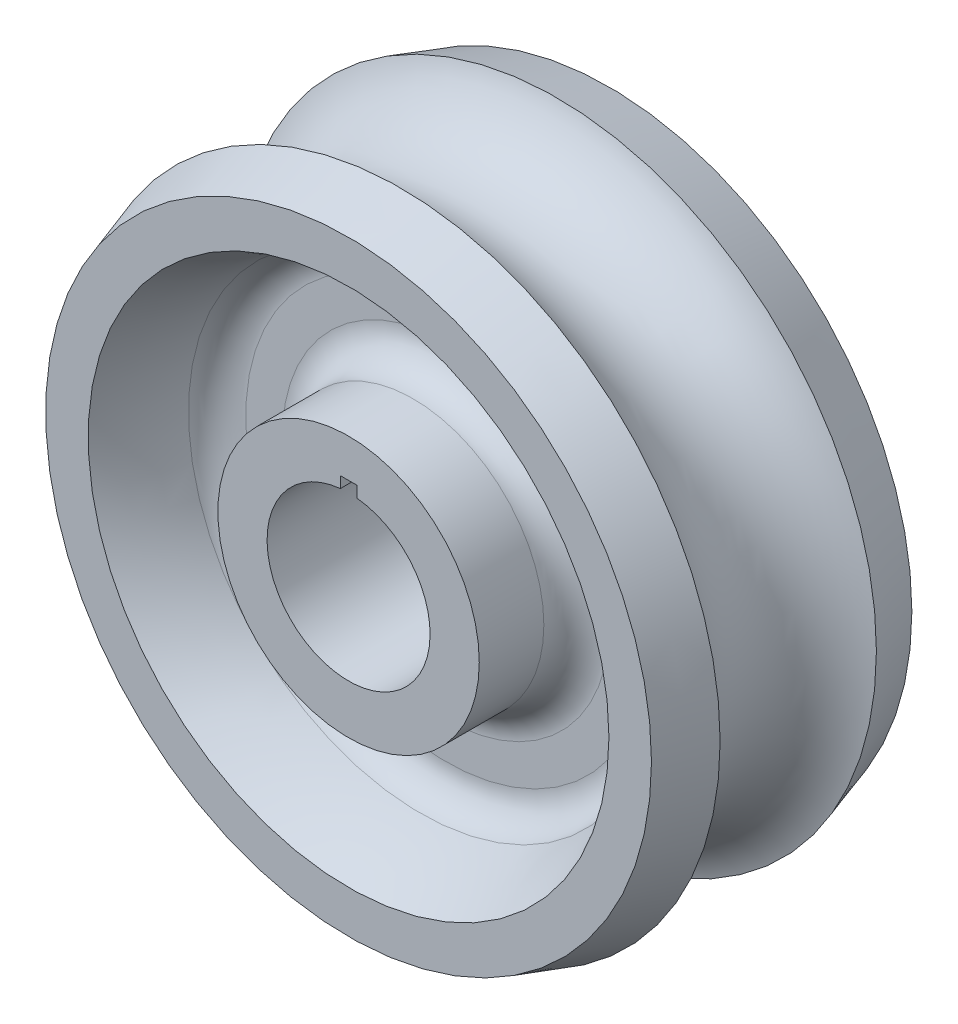
ISO-10303-21;
HEADER;
FILE_DESCRIPTION(('STEP AP214'),'2;1');
FILE_NAME('part.step','',(''),(''),'','','');
FILE_SCHEMA(('AUTOMOTIVE_DESIGN { 1 0 10303 214 1 1 1 1 }'));
ENDSEC;
DATA;
#1=APPLICATION_CONTEXT('core data for automotive mechanical design processes');
#2=APPLICATION_PROTOCOL_DEFINITION('international standard','automotive_design',2000,#1);
#3=PRODUCT_CONTEXT('',#1,'mechanical');
#4=PRODUCT('Part','Part','',(#3));
#5=PRODUCT_RELATED_PRODUCT_CATEGORY('part','',(#4));
#6=PRODUCT_DEFINITION_FORMATION('','',#4);
#7=PRODUCT_DEFINITION_CONTEXT('part definition',#1,'design');
#8=PRODUCT_DEFINITION('design','',#6,#7);
#9=PRODUCT_DEFINITION_SHAPE('','',#8);
#10=(LENGTH_UNIT() NAMED_UNIT(*) SI_UNIT(.MILLI.,.METRE.));
#11=(NAMED_UNIT(*) PLANE_ANGLE_UNIT() SI_UNIT($,.RADIAN.));
#12=(NAMED_UNIT(*) SI_UNIT($,.STERADIAN.) SOLID_ANGLE_UNIT());
#13=UNCERTAINTY_MEASURE_WITH_UNIT(LENGTH_MEASURE(1.E-05),#10,'distance_accuracy_value','');
#14=(GEOMETRIC_REPRESENTATION_CONTEXT(3) GLOBAL_UNCERTAINTY_ASSIGNED_CONTEXT((#13)) GLOBAL_UNIT_ASSIGNED_CONTEXT((#10,
#11,#12)) REPRESENTATION_CONTEXT('',''));
#15=CARTESIAN_POINT('',(0.,0.,0.));
#16=DIRECTION('',(0.,0.,1.));
#17=DIRECTION('',(1.,0.,0.));
#18=AXIS2_PLACEMENT_3D('',#15,#16,#17);
#19=CARTESIAN_POINT('',(0.,7.95,-12.7));
#20=DIRECTION('',(0.,0.,1.));
#21=DIRECTION('',(1.,0.,0.));
#22=AXIS2_PLACEMENT_3D('',#19,#20,#21);
#23=PLANE('',#22);
#24=CARTESIAN_POINT('',(0.,0.,-12.7));
#25=DIRECTION('',(0.,0.,1.));
#26=DIRECTION('',(1.,0.,0.));
#27=AXIS2_PLACEMENT_3D('',#24,#25,#26);
#28=CIRCLE('',#27,12.75);
#29=CARTESIAN_POINT('',(12.75,0.,-12.7));
#30=VERTEX_POINT('',#29);
#31=EDGE_CURVE('E106',#30,#30,#28,.T.);
#32=ORIENTED_EDGE('',*,*,#31,.F.);
#33=EDGE_LOOP('',(#32));
#34=FACE_BOUND('',#33,.T.);
#35=DIRECTION('',(0.,1.,0.));
#36=VECTOR('',#35,1.);
#37=CARTESIAN_POINT('',(-0.8,7.90964600977819,-12.7));
#38=LINE('',#37,#36);
#39=CARTESIAN_POINT('',(-0.8,7.90964600977819,-12.7));
#40=VERTEX_POINT('',#39);
#41=CARTESIAN_POINT('',(-0.8,9.,-12.7));
#42=VERTEX_POINT('',#41);
#43=EDGE_CURVE('E79',#40,#42,#38,.T.);
#44=ORIENTED_EDGE('',*,*,#43,.F.);
#45=CARTESIAN_POINT('',(0.,0.,-12.7));
#46=DIRECTION('',(0.,0.,1.));
#47=DIRECTION('',(1.,0.,0.));
#48=AXIS2_PLACEMENT_3D('',#45,#46,#47);
#49=CIRCLE('',#48,7.95);
#50=CARTESIAN_POINT('',(0.8,7.90964600977819,-12.7));
#51=VERTEX_POINT('',#50);
#52=EDGE_CURVE('E11',#40,#51,#49,.T.);
#53=ORIENTED_EDGE('',*,*,#52,.T.);
#54=DIRECTION('',(0.,1.,0.));
#55=VECTOR('',#54,1.);
#56=CARTESIAN_POINT('',(0.8,7.90964600977819,-12.7));
#57=LINE('',#56,#55);
#58=CARTESIAN_POINT('',(0.8,9.,-12.7));
#59=VERTEX_POINT('',#58);
#60=EDGE_CURVE('E55',#51,#59,#57,.T.);
#61=ORIENTED_EDGE('',*,*,#60,.T.);
#62=DIRECTION('',(1.,0.,0.));
#63=VECTOR('',#62,1.);
#64=CARTESIAN_POINT('',(-0.8,9.,-12.7));
#65=LINE('',#64,#63);
#66=EDGE_CURVE('E86',#42,#59,#65,.T.);
#67=ORIENTED_EDGE('',*,*,#66,.F.);
#68=EDGE_LOOP('',(#44,#53,#61,#67));
#69=FACE_BOUND('',#68,.T.);
#70=ADVANCED_FACE('F34',(#34,#69),#23,.F.);
#71=CARTESIAN_POINT('',(0.,0.,0.));
#72=DIRECTION('',(0.,0.,1.));
#73=DIRECTION('',(1.,0.,0.));
#74=AXIS2_PLACEMENT_3D('',#71,#72,#73);
#75=CYLINDRICAL_SURFACE('',#74,7.95);
#76=DIRECTION('',(0.,0.,1.));
#77=VECTOR('',#76,1.);
#78=CARTESIAN_POINT('',(-0.8,7.90964600977819,-12.7));
#79=LINE('',#78,#77);
#80=CARTESIAN_POINT('',(-0.8,7.90964600977819,12.7));
#81=VERTEX_POINT('',#80);
#82=EDGE_CURVE('E77',#40,#81,#79,.T.);
#83=ORIENTED_EDGE('',*,*,#82,.T.);
#84=CARTESIAN_POINT('',(0.,0.,12.7));
#85=DIRECTION('',(0.,0.,1.));
#86=DIRECTION('',(1.,0.,0.));
#87=AXIS2_PLACEMENT_3D('',#84,#85,#86);
#88=CIRCLE('',#87,7.95);
#89=CARTESIAN_POINT('',(0.8,7.90964600977819,12.7));
#90=VERTEX_POINT('',#89);
#91=EDGE_CURVE('E42',#81,#90,#88,.T.);
#92=ORIENTED_EDGE('',*,*,#91,.T.);
#93=DIRECTION('',(0.,0.,1.));
#94=VECTOR('',#93,1.);
#95=CARTESIAN_POINT('',(0.8,7.90964600977819,-12.7));
#96=LINE('',#95,#94);
#97=EDGE_CURVE('E49',#51,#90,#96,.T.);
#98=ORIENTED_EDGE('',*,*,#97,.F.);
#99=ORIENTED_EDGE('',*,*,#52,.F.);
#100=EDGE_LOOP('',(#83,#92,#98,#99));
#101=FACE_BOUND('',#100,.T.);
#102=ADVANCED_FACE('F158',(#101),#75,.F.);
#103=CARTESIAN_POINT('',(0.,7.95,12.7));
#104=DIRECTION('',(0.,0.,1.));
#105=DIRECTION('',(1.,0.,0.));
#106=AXIS2_PLACEMENT_3D('',#103,#104,#105);
#107=PLANE('',#106);
#108=CARTESIAN_POINT('',(0.,0.,12.7));
#109=DIRECTION('',(0.,0.,1.));
#110=DIRECTION('',(1.,0.,0.));
#111=AXIS2_PLACEMENT_3D('',#108,#109,#110);
#112=CIRCLE('',#111,12.75);
#113=CARTESIAN_POINT('',(12.75,0.,12.7));
#114=VERTEX_POINT('',#113);
#115=EDGE_CURVE('E151',#114,#114,#112,.T.);
#116=ORIENTED_EDGE('',*,*,#115,.T.);
#117=EDGE_LOOP('',(#116));
#118=FACE_BOUND('',#117,.T.);
#119=ORIENTED_EDGE('',*,*,#91,.F.);
#120=DIRECTION('',(0.,1.,0.));
#121=VECTOR('',#120,1.);
#122=CARTESIAN_POINT('',(-0.8,7.90964600977819,12.7));
#123=LINE('',#122,#121);
#124=CARTESIAN_POINT('',(-0.8,9.,12.7));
#125=VERTEX_POINT('',#124);
#126=EDGE_CURVE('E98',#81,#125,#123,.T.);
#127=ORIENTED_EDGE('',*,*,#126,.T.);
#128=DIRECTION('',(1.,0.,0.));
#129=VECTOR('',#128,1.);
#130=CARTESIAN_POINT('',(-0.8,9.,12.7));
#131=LINE('',#130,#129);
#132=CARTESIAN_POINT('',(0.8,9.,12.7));
#133=VERTEX_POINT('',#132);
#134=EDGE_CURVE('E91',#125,#133,#131,.T.);
#135=ORIENTED_EDGE('',*,*,#134,.T.);
#136=DIRECTION('',(0.,1.,0.));
#137=VECTOR('',#136,1.);
#138=CARTESIAN_POINT('',(0.8,7.90964600977819,12.7));
#139=LINE('',#138,#137);
#140=EDGE_CURVE('E87',#90,#133,#139,.T.);
#141=ORIENTED_EDGE('',*,*,#140,.F.);
#142=EDGE_LOOP('',(#119,#127,#135,#141));
#143=FACE_BOUND('',#142,.T.);
#144=ADVANCED_FACE('F160',(#118,#143),#107,.T.);
#145=CARTESIAN_POINT('',(0.,0.,0.));
#146=DIRECTION('',(0.,0.,1.));
#147=DIRECTION('',(1.,0.,0.));
#148=AXIS2_PLACEMENT_3D('',#145,#146,#147);
#149=CYLINDRICAL_SURFACE('',#148,12.75);
#150=CARTESIAN_POINT('',(0.,0.,6.4));
#151=DIRECTION('',(0.,0.,1.));
#152=DIRECTION('',(1.,0.,0.));
#153=AXIS2_PLACEMENT_3D('',#150,#151,#152);
#154=CIRCLE('',#153,12.75);
#155=CARTESIAN_POINT('',(12.75,0.,6.4));
#156=VERTEX_POINT('',#155);
#157=EDGE_CURVE('E148',#156,#156,#154,.T.);
#158=ORIENTED_EDGE('',*,*,#157,.T.);
#159=EDGE_LOOP('',(#158));
#160=FACE_BOUND('',#159,.T.);
#161=ORIENTED_EDGE('',*,*,#115,.F.);
#162=EDGE_LOOP('',(#161));
#163=FACE_BOUND('',#162,.T.);
#164=ADVANCED_FACE('F236',(#160,#163),#149,.T.);
#165=CARTESIAN_POINT('',(0.,0.,6.4));
#166=DIRECTION('',(0.,0.,1.));
#167=DIRECTION('',(1.,0.,0.));
#168=AXIS2_PLACEMENT_3D('',#165,#166,#167);
#169=TOROIDAL_SURFACE('',#168,15.95,3.2);
#170=CARTESIAN_POINT('',(0.,0.,3.2));
#171=DIRECTION('',(0.,0.,1.));
#172=DIRECTION('',(1.,0.,0.));
#173=AXIS2_PLACEMENT_3D('',#170,#171,#172);
#174=CIRCLE('',#173,15.95);
#175=CARTESIAN_POINT('',(15.95,0.,3.2));
#176=VERTEX_POINT('',#175);
#177=EDGE_CURVE('E145',#176,#176,#174,.T.);
#178=ORIENTED_EDGE('',*,*,#177,.T.);
#179=EDGE_LOOP('',(#178));
#180=FACE_BOUND('',#179,.T.);
#181=ORIENTED_EDGE('',*,*,#157,.F.);
#182=EDGE_LOOP('',(#181));
#183=FACE_BOUND('',#182,.T.);
#184=ADVANCED_FACE('F232',(#180,#183),#169,.F.);
#185=CARTESIAN_POINT('',(0.,15.95,3.2));
#186=DIRECTION('',(0.,0.,1.));
#187=DIRECTION('',(1.,0.,0.));
#188=AXIS2_PLACEMENT_3D('',#185,#186,#187);
#189=PLANE('',#188);
#190=CARTESIAN_POINT('',(0.,0.,3.2));
#191=DIRECTION('',(0.,0.,1.));
#192=DIRECTION('',(1.,0.,0.));
#193=AXIS2_PLACEMENT_3D('',#190,#191,#192);
#194=CIRCLE('',#193,19.522325526592);
#195=CARTESIAN_POINT('',(19.522325526592,0.,3.2));
#196=VERTEX_POINT('',#195);
#197=EDGE_CURVE('E142',#196,#196,#194,.T.);
#198=ORIENTED_EDGE('',*,*,#197,.T.);
#199=EDGE_LOOP('',(#198));
#200=FACE_BOUND('',#199,.T.);
#201=ORIENTED_EDGE('',*,*,#177,.F.);
#202=EDGE_LOOP('',(#201));
#203=FACE_BOUND('',#202,.T.);
#204=ADVANCED_FACE('F228',(#200,#203),#189,.T.);
#205=CARTESIAN_POINT('',(0.,0.,6.4));
#206=DIRECTION('',(0.,0.,1.));
#207=DIRECTION('',(1.,0.,0.));
#208=AXIS2_PLACEMENT_3D('',#205,#206,#207);
#209=TOROIDAL_SURFACE('',#208,19.522325526592,3.2);
#210=CARTESIAN_POINT('',(0.,0.,5.68391608391608));
#211=DIRECTION('',(0.,0.,1.));
#212=DIRECTION('',(1.,0.,0.));
#213=AXIS2_PLACEMENT_3D('',#210,#211,#212);
#214=CIRCLE('',#213,22.6411752865397);
#215=CARTESIAN_POINT('',(22.6411752865397,0.,5.68391608391608));
#216=VERTEX_POINT('',#215);
#217=EDGE_CURVE('E139',#216,#216,#214,.T.);
#218=ORIENTED_EDGE('',*,*,#217,.T.);
#219=EDGE_LOOP('',(#218));
#220=FACE_BOUND('',#219,.T.);
#221=ORIENTED_EDGE('',*,*,#197,.F.);
#222=EDGE_LOOP('',(#221));
#223=FACE_BOUND('',#222,.T.);
#224=ADVANCED_FACE('F224',(#220,#223),#209,.F.);
#225=CARTESIAN_POINT('',(0.,0.,0.));
#226=DIRECTION('',(0.,0.,1.));
#227=DIRECTION('',(1.,0.,0.));
#228=AXIS2_PLACEMENT_3D('',#225,#226,#227);
#229=TOROIDAL_SURFACE('',#228,47.3970452561247,25.4);
#230=CARTESIAN_POINT('',(0.,0.,12.7));
#231=DIRECTION('',(0.,0.,1.));
#232=DIRECTION('',(1.,0.,0.));
#233=AXIS2_PLACEMENT_3D('',#230,#231,#232);
#234=CIRCLE('',#233,25.4);
#235=CARTESIAN_POINT('',(25.4,0.,12.7));
#236=VERTEX_POINT('',#235);
#237=EDGE_CURVE('E136',#236,#236,#234,.T.);
#238=ORIENTED_EDGE('',*,*,#237,.T.);
#239=EDGE_LOOP('',(#238));
#240=FACE_BOUND('',#239,.T.);
#241=ORIENTED_EDGE('',*,*,#217,.F.);
#242=EDGE_LOOP('',(#241));
#243=FACE_BOUND('',#242,.T.);
#244=ADVANCED_FACE('F220',(#240,#243),#229,.T.);
#245=CARTESIAN_POINT('',(0.,25.4,12.7));
#246=DIRECTION('',(0.,0.,1.));
#247=DIRECTION('',(1.,0.,0.));
#248=AXIS2_PLACEMENT_3D('',#245,#246,#247);
#249=PLANE('',#248);
#250=CARTESIAN_POINT('',(0.,0.,12.7));
#251=DIRECTION('',(0.,0.,1.));
#252=DIRECTION('',(1.,0.,0.));
#253=AXIS2_PLACEMENT_3D('',#250,#251,#252);
#254=CIRCLE('',#253,29.55);
#255=CARTESIAN_POINT('',(29.55,0.,12.7));
#256=VERTEX_POINT('',#255);
#257=EDGE_CURVE('E133',#256,#256,#254,.T.);
#258=ORIENTED_EDGE('',*,*,#257,.T.);
#259=EDGE_LOOP('',(#258));
#260=FACE_BOUND('',#259,.T.);
#261=ORIENTED_EDGE('',*,*,#237,.F.);
#262=EDGE_LOOP('',(#261));
#263=FACE_BOUND('',#262,.T.);
#264=ADVANCED_FACE('F216',(#260,#263),#249,.T.);
#265=CARTESIAN_POINT('',(0.,0.,12.7));
#266=DIRECTION('',(0.,0.,-1.));
#267=DIRECTION('',(-1.,0.,0.));
#268=AXIS2_PLACEMENT_3D('',#265,#266,#267);
#269=CONICAL_SURFACE('',#268,29.55,0.308702659080135);
#270=CARTESIAN_POINT('',(0.,0.,7.62182826714897));
#271=DIRECTION('',(0.,0.,1.));
#272=DIRECTION('',(1.,0.,0.));
#273=AXIS2_PLACEMENT_3D('',#270,#271,#272);
#274=CIRCLE('',#273,31.1694169699249);
#275=CARTESIAN_POINT('',(31.1694169699249,0.,7.62182826714897));
#276=VERTEX_POINT('',#275);
#277=EDGE_CURVE('E130',#276,#276,#274,.T.);
#278=ORIENTED_EDGE('',*,*,#277,.T.);
#279=EDGE_LOOP('',(#278));
#280=FACE_BOUND('',#279,.T.);
#281=ORIENTED_EDGE('',*,*,#257,.F.);
#282=EDGE_LOOP('',(#281));
#283=FACE_BOUND('',#282,.T.);
#284=ADVANCED_FACE('F212',(#280,#283),#269,.T.);
#285=CARTESIAN_POINT('',(0.,0.,0.));
#286=DIRECTION('',(0.,0.,1.));
#287=DIRECTION('',(1.,0.,0.));
#288=AXIS2_PLACEMENT_3D('',#285,#286,#287);
#289=TOROIDAL_SURFACE('',#288,33.6,8.);
#290=ORIENTED_EDGE('',*,*,#277,.F.);
#291=EDGE_LOOP('',(#290));
#292=FACE_BOUND('',#291,.T.);
#293=CARTESIAN_POINT('',(0.,0.,-7.62182826714897));
#294=DIRECTION('',(0.,0.,1.));
#295=DIRECTION('',(1.,0.,0.));
#296=AXIS2_PLACEMENT_3D('',#293,#294,#295);
#297=CIRCLE('',#296,31.1694169699249);
#298=CARTESIAN_POINT('',(31.1694169699249,0.,-7.62182826714897));
#299=VERTEX_POINT('',#298);
#300=EDGE_CURVE('E127',#299,#299,#297,.T.);
#301=ORIENTED_EDGE('',*,*,#300,.T.);
#302=EDGE_LOOP('',(#301));
#303=FACE_BOUND('',#302,.T.);
#304=ADVANCED_FACE('F208',(#292,#303),#289,.F.);
#305=CARTESIAN_POINT('',(0.,0.,-12.7));
#306=DIRECTION('',(0.,0.,1.));
#307=DIRECTION('',(1.,0.,0.));
#308=AXIS2_PLACEMENT_3D('',#305,#306,#307);
#309=CONICAL_SURFACE('',#308,29.55,0.308702659080135);
#310=ORIENTED_EDGE('',*,*,#300,.F.);
#311=EDGE_LOOP('',(#310));
#312=FACE_BOUND('',#311,.T.);
#313=CARTESIAN_POINT('',(0.,0.,-12.7));
#314=DIRECTION('',(0.,0.,1.));
#315=DIRECTION('',(1.,0.,0.));
#316=AXIS2_PLACEMENT_3D('',#313,#314,#315);
#317=CIRCLE('',#316,29.55);
#318=CARTESIAN_POINT('',(29.55,0.,-12.7));
#319=VERTEX_POINT('',#318);
#320=EDGE_CURVE('E124',#319,#319,#317,.T.);
#321=ORIENTED_EDGE('',*,*,#320,.T.);
#322=EDGE_LOOP('',(#321));
#323=FACE_BOUND('',#322,.T.);
#324=ADVANCED_FACE('F204',(#312,#323),#309,.T.);
#325=CARTESIAN_POINT('',(0.,25.4,-12.7));
#326=DIRECTION('',(0.,0.,1.));
#327=DIRECTION('',(1.,0.,0.));
#328=AXIS2_PLACEMENT_3D('',#325,#326,#327);
#329=PLANE('',#328);
#330=ORIENTED_EDGE('',*,*,#320,.F.);
#331=EDGE_LOOP('',(#330));
#332=FACE_BOUND('',#331,.T.);
#333=CARTESIAN_POINT('',(0.,0.,-12.7));
#334=DIRECTION('',(0.,0.,1.));
#335=DIRECTION('',(1.,0.,0.));
#336=AXIS2_PLACEMENT_3D('',#333,#334,#335);
#337=CIRCLE('',#336,25.4);
#338=CARTESIAN_POINT('',(25.4,0.,-12.7));
#339=VERTEX_POINT('',#338);
#340=EDGE_CURVE('E121',#339,#339,#337,.T.);
#341=ORIENTED_EDGE('',*,*,#340,.T.);
#342=EDGE_LOOP('',(#341));
#343=FACE_BOUND('',#342,.T.);
#344=ADVANCED_FACE('F200',(#332,#343),#329,.F.);
#345=CARTESIAN_POINT('',(0.,0.,0.));
#346=DIRECTION('',(0.,0.,1.));
#347=DIRECTION('',(1.,0.,0.));
#348=AXIS2_PLACEMENT_3D('',#345,#346,#347);
#349=TOROIDAL_SURFACE('',#348,47.3970452561247,25.4);
#350=ORIENTED_EDGE('',*,*,#340,.F.);
#351=EDGE_LOOP('',(#350));
#352=FACE_BOUND('',#351,.T.);
#353=CARTESIAN_POINT('',(0.,0.,-5.68391608391608));
#354=DIRECTION('',(0.,0.,1.));
#355=DIRECTION('',(1.,0.,0.));
#356=AXIS2_PLACEMENT_3D('',#353,#354,#355);
#357=CIRCLE('',#356,22.6411752865397);
#358=CARTESIAN_POINT('',(22.6411752865397,0.,-5.68391608391608));
#359=VERTEX_POINT('',#358);
#360=EDGE_CURVE('E118',#359,#359,#357,.T.);
#361=ORIENTED_EDGE('',*,*,#360,.T.);
#362=EDGE_LOOP('',(#361));
#363=FACE_BOUND('',#362,.T.);
#364=ADVANCED_FACE('F196',(#352,#363),#349,.T.);
#365=CARTESIAN_POINT('',(0.,0.,-6.4));
#366=DIRECTION('',(0.,0.,1.));
#367=DIRECTION('',(1.,0.,0.));
#368=AXIS2_PLACEMENT_3D('',#365,#366,#367);
#369=TOROIDAL_SURFACE('',#368,19.522325526592,3.2);
#370=ORIENTED_EDGE('',*,*,#360,.F.);
#371=EDGE_LOOP('',(#370));
#372=FACE_BOUND('',#371,.T.);
#373=CARTESIAN_POINT('',(0.,0.,-3.2));
#374=DIRECTION('',(0.,0.,1.));
#375=DIRECTION('',(1.,0.,0.));
#376=AXIS2_PLACEMENT_3D('',#373,#374,#375);
#377=CIRCLE('',#376,19.522325526592);
#378=CARTESIAN_POINT('',(19.522325526592,0.,-3.2));
#379=VERTEX_POINT('',#378);
#380=EDGE_CURVE('E115',#379,#379,#377,.T.);
#381=ORIENTED_EDGE('',*,*,#380,.T.);
#382=EDGE_LOOP('',(#381));
#383=FACE_BOUND('',#382,.T.);
#384=ADVANCED_FACE('F192',(#372,#383),#369,.F.);
#385=CARTESIAN_POINT('',(0.,15.95,-3.2));
#386=DIRECTION('',(0.,0.,1.));
#387=DIRECTION('',(1.,0.,0.));
#388=AXIS2_PLACEMENT_3D('',#385,#386,#387);
#389=PLANE('',#388);
#390=ORIENTED_EDGE('',*,*,#380,.F.);
#391=EDGE_LOOP('',(#390));
#392=FACE_BOUND('',#391,.T.);
#393=CARTESIAN_POINT('',(0.,0.,-3.2));
#394=DIRECTION('',(0.,0.,1.));
#395=DIRECTION('',(1.,0.,0.));
#396=AXIS2_PLACEMENT_3D('',#393,#394,#395);
#397=CIRCLE('',#396,15.95);
#398=CARTESIAN_POINT('',(15.95,0.,-3.2));
#399=VERTEX_POINT('',#398);
#400=EDGE_CURVE('E112',#399,#399,#397,.T.);
#401=ORIENTED_EDGE('',*,*,#400,.T.);
#402=EDGE_LOOP('',(#401));
#403=FACE_BOUND('',#402,.T.);
#404=ADVANCED_FACE('F185',(#392,#403),#389,.F.);
#405=CARTESIAN_POINT('',(0.,0.,-6.4));
#406=DIRECTION('',(0.,0.,1.));
#407=DIRECTION('',(1.,0.,0.));
#408=AXIS2_PLACEMENT_3D('',#405,#406,#407);
#409=TOROIDAL_SURFACE('',#408,15.95,3.2);
#410=ORIENTED_EDGE('',*,*,#400,.F.);
#411=EDGE_LOOP('',(#410));
#412=FACE_BOUND('',#411,.T.);
#413=CARTESIAN_POINT('',(0.,0.,-6.4));
#414=DIRECTION('',(0.,0.,1.));
#415=DIRECTION('',(1.,0.,0.));
#416=AXIS2_PLACEMENT_3D('',#413,#414,#415);
#417=CIRCLE('',#416,12.75);
#418=CARTESIAN_POINT('',(12.75,0.,-6.4));
#419=VERTEX_POINT('',#418);
#420=EDGE_CURVE('E109',#419,#419,#417,.T.);
#421=ORIENTED_EDGE('',*,*,#420,.T.);
#422=EDGE_LOOP('',(#421));
#423=FACE_BOUND('',#422,.T.);
#424=ADVANCED_FACE('F177',(#412,#423),#409,.F.);
#425=CARTESIAN_POINT('',(0.,0.,0.));
#426=DIRECTION('',(0.,0.,1.));
#427=DIRECTION('',(1.,0.,0.));
#428=AXIS2_PLACEMENT_3D('',#425,#426,#427);
#429=CYLINDRICAL_SURFACE('',#428,12.75);
#430=ORIENTED_EDGE('',*,*,#420,.F.);
#431=EDGE_LOOP('',(#430));
#432=FACE_BOUND('',#431,.T.);
#433=ORIENTED_EDGE('',*,*,#31,.T.);
#434=EDGE_LOOP('',(#433));
#435=FACE_BOUND('',#434,.T.);
#436=ADVANCED_FACE('F175',(#432,#435),#429,.T.);
#437=CARTESIAN_POINT('',(-0.8,7.90964600977819,-12.7));
#438=DIRECTION('',(1.,0.,0.));
#439=DIRECTION('',(0.,1.,0.));
#440=AXIS2_PLACEMENT_3D('',#437,#438,#439);
#441=PLANE('',#440);
#442=ORIENTED_EDGE('',*,*,#126,.F.);
#443=ORIENTED_EDGE('',*,*,#82,.F.);
#444=ORIENTED_EDGE('',*,*,#43,.T.);
#445=DIRECTION('',(0.,0.,1.));
#446=VECTOR('',#445,1.);
#447=CARTESIAN_POINT('',(-0.8,9.,-12.7));
#448=LINE('',#447,#446);
#449=EDGE_CURVE('E82',#42,#125,#448,.T.);
#450=ORIENTED_EDGE('',*,*,#449,.T.);
#451=EDGE_LOOP('',(#442,#443,#444,#450));
#452=FACE_BOUND('',#451,.T.);
#453=ADVANCED_FACE('F81',(#452),#441,.T.);
#454=CARTESIAN_POINT('',(-0.8,9.,-12.7));
#455=DIRECTION('',(0.,-1.,0.));
#456=DIRECTION('',(0.,0.,-1.));
#457=AXIS2_PLACEMENT_3D('',#454,#455,#456);
#458=PLANE('',#457);
#459=ORIENTED_EDGE('',*,*,#134,.F.);
#460=ORIENTED_EDGE('',*,*,#449,.F.);
#461=ORIENTED_EDGE('',*,*,#66,.T.);
#462=DIRECTION('',(0.,0.,1.));
#463=VECTOR('',#462,1.);
#464=CARTESIAN_POINT('',(0.8,9.,-12.7));
#465=LINE('',#464,#463);
#466=EDGE_CURVE('E71',#59,#133,#465,.T.);
#467=ORIENTED_EDGE('',*,*,#466,.T.);
#468=EDGE_LOOP('',(#459,#460,#461,#467));
#469=FACE_BOUND('',#468,.T.);
#470=ADVANCED_FACE('F89',(#469),#458,.T.);
#471=CARTESIAN_POINT('',(0.8,7.90964600977819,-12.7));
#472=DIRECTION('',(1.,0.,0.));
#473=DIRECTION('',(0.,1.,0.));
#474=AXIS2_PLACEMENT_3D('',#471,#472,#473);
#475=PLANE('',#474);
#476=ORIENTED_EDGE('',*,*,#140,.T.);
#477=ORIENTED_EDGE('',*,*,#466,.F.);
#478=ORIENTED_EDGE('',*,*,#60,.F.);
#479=ORIENTED_EDGE('',*,*,#97,.T.);
#480=EDGE_LOOP('',(#476,#477,#478,#479));
#481=FACE_BOUND('',#480,.T.);
#482=ADVANCED_FACE('F161',(#481),#475,.F.);
#483=CLOSED_SHELL('',(#70,#102,#144,#164,#184,#204,#224,#244,#264,#284,#304,#324,#344,#364,#384,
#404,#424,#436,#453,#470,#482));
#484=MANIFOLD_SOLID_BREP('B2',#483);
#485=ADVANCED_BREP_SHAPE_REPRESENTATION('',(#18,#484),#14);
#486=SHAPE_DEFINITION_REPRESENTATION(#9,#485);
ENDSEC;
END-ISO-10303-21;
